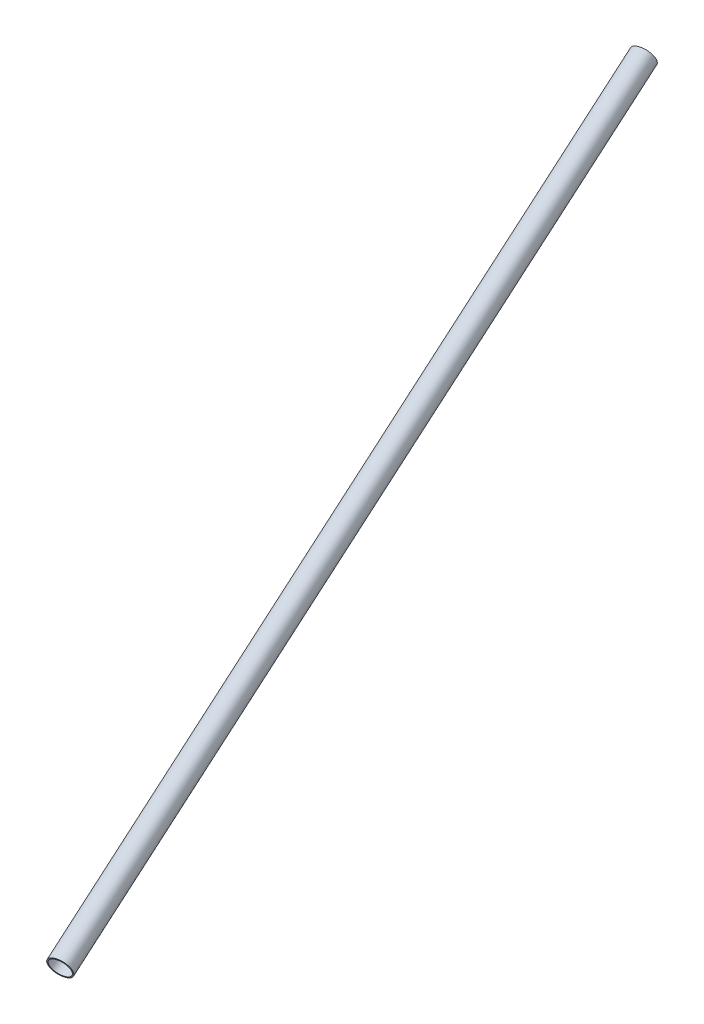
ISO-10303-21;
HEADER;
FILE_DESCRIPTION(('STEP AP214'),'2;1');
FILE_NAME('part.step','',(''),(''),'','','');
FILE_SCHEMA(('AUTOMOTIVE_DESIGN { 1 0 10303 214 1 1 1 1 }'));
ENDSEC;
DATA;
#1=APPLICATION_CONTEXT('core data for automotive mechanical design processes');
#2=APPLICATION_PROTOCOL_DEFINITION('international standard','automotive_design',2000,#1);
#3=PRODUCT_CONTEXT('',#1,'mechanical');
#4=PRODUCT('Part','Part','',(#3));
#5=PRODUCT_RELATED_PRODUCT_CATEGORY('part','',(#4));
#6=PRODUCT_DEFINITION_FORMATION('','',#4);
#7=PRODUCT_DEFINITION_CONTEXT('part definition',#1,'design');
#8=PRODUCT_DEFINITION('design','',#6,#7);
#9=PRODUCT_DEFINITION_SHAPE('','',#8);
#10=(LENGTH_UNIT() NAMED_UNIT(*) SI_UNIT(.MILLI.,.METRE.));
#11=(NAMED_UNIT(*) PLANE_ANGLE_UNIT() SI_UNIT($,.RADIAN.));
#12=(NAMED_UNIT(*) SI_UNIT($,.STERADIAN.) SOLID_ANGLE_UNIT());
#13=UNCERTAINTY_MEASURE_WITH_UNIT(LENGTH_MEASURE(1.E-05),#10,'distance_accuracy_value','');
#14=(GEOMETRIC_REPRESENTATION_CONTEXT(3) GLOBAL_UNCERTAINTY_ASSIGNED_CONTEXT((#13)) GLOBAL_UNIT_ASSIGNED_CONTEXT((#10,
#11,#12)) REPRESENTATION_CONTEXT('',''));
#15=CARTESIAN_POINT('',(0.,0.,0.));
#16=DIRECTION('',(0.,0.,1.));
#17=DIRECTION('',(1.,0.,0.));
#18=AXIS2_PLACEMENT_3D('',#15,#16,#17);
#19=CARTESIAN_POINT('',(-325.,320.,-1580.));
#20=DIRECTION('',(0.208710809439999,-0.381642622975999,0.900438063583998));
#21=DIRECTION('',(0.,-0.920714591276893,-0.390236647958419));
#22=AXIS2_PLACEMENT_3D('',#19,#20,#21);
#23=CYLINDRICAL_SURFACE('',#22,9.79999999999998);
#24=CARTESIAN_POINT('',(-325.,320.,-1580.));
#25=DIRECTION('',(-0.208710809439999,0.381642622975999,-0.900438063583998));
#26=DIRECTION('',(0.626062072534467,-0.655192350751652,-0.422811145608027));
#27=AXIS2_PLACEMENT_3D('',#24,#25,#26);
#28=CIRCLE('',#27,9.79999999999998);
#29=CARTESIAN_POINT('',(-318.864591689162,313.579114962633,-1584.14354922696));
#30=VERTEX_POINT('',#29);
#31=EDGE_CURVE('E46',#30,#30,#28,.T.);
#32=ORIENTED_EDGE('',*,*,#31,.T.);
#33=EDGE_LOOP('',(#32));
#34=FACE_BOUND('',#33,.T.);
#35=CARTESIAN_POINT('',(-150.,-4.44089209850063E-13,-825.));
#36=DIRECTION('',(-0.208710809439999,0.381642622975999,-0.900438063583998));
#37=DIRECTION('',(0.626062072534467,-0.655192350751652,-0.422811145608027));
#38=AXIS2_PLACEMENT_3D('',#35,#36,#37);
#39=CIRCLE('',#38,9.79999999999998);
#40=CARTESIAN_POINT('',(-143.864591689163,-6.42088503736662,-829.143549226959));
#41=VERTEX_POINT('',#40);
#42=EDGE_CURVE('E52',#41,#41,#39,.T.);
#43=ORIENTED_EDGE('',*,*,#42,.F.);
#44=EDGE_LOOP('',(#43));
#45=FACE_BOUND('',#44,.T.);
#46=ADVANCED_FACE('F39',(#34,#45),#23,.F.);
#47=CARTESIAN_POINT('',(-325.,320.,-1580.));
#48=DIRECTION('',(0.208710809439999,-0.381642622975999,0.900438063583998));
#49=DIRECTION('',(0.,-0.920714591276893,-0.390236647958419));
#50=AXIS2_PLACEMENT_3D('',#47,#48,#49);
#51=CYLINDRICAL_SURFACE('',#50,11.);
#52=CARTESIAN_POINT('',(-325.,320.,-1580.));
#53=DIRECTION('',(-0.208710809439999,0.381642622975999,-0.900438063583998));
#54=DIRECTION('',(0.626062072534467,-0.655192350751652,-0.422811145608027));
#55=AXIS2_PLACEMENT_3D('',#52,#53,#54);
#56=CIRCLE('',#55,11.);
#57=CARTESIAN_POINT('',(-318.113317202121,312.792884141731,-1584.65092260169));
#58=VERTEX_POINT('',#57);
#59=EDGE_CURVE('E10',#58,#58,#56,.T.);
#60=ORIENTED_EDGE('',*,*,#59,.F.);
#61=EDGE_LOOP('',(#60));
#62=FACE_BOUND('',#61,.T.);
#63=CARTESIAN_POINT('',(-150.,-4.44089209850063E-13,-825.));
#64=DIRECTION('',(-0.208710809439999,0.381642622975999,-0.900438063583998));
#65=DIRECTION('',(0.626062072534467,-0.655192350751652,-0.422811145608027));
#66=AXIS2_PLACEMENT_3D('',#63,#64,#65);
#67=CIRCLE('',#66,11.);
#68=CARTESIAN_POINT('',(-143.113317202121,-7.20711585826862,-829.650922601688));
#69=VERTEX_POINT('',#68);
#70=EDGE_CURVE('E42',#69,#69,#67,.T.);
#71=ORIENTED_EDGE('',*,*,#70,.T.);
#72=EDGE_LOOP('',(#71));
#73=FACE_BOUND('',#72,.T.);
#74=ADVANCED_FACE('F59',(#62,#73),#51,.T.);
#75=CARTESIAN_POINT('',(-325.,320.,-1580.));
#76=DIRECTION('',(-0.208710809439999,0.381642622975999,-0.900438063583998));
#77=DIRECTION('',(0.626062072534467,-0.655192350751652,-0.422811145608027));
#78=AXIS2_PLACEMENT_3D('',#75,#76,#77);
#79=PLANE('',#78);
#80=ORIENTED_EDGE('',*,*,#31,.F.);
#81=EDGE_LOOP('',(#80));
#82=FACE_BOUND('',#81,.T.);
#83=ORIENTED_EDGE('',*,*,#59,.T.);
#84=EDGE_LOOP('',(#83));
#85=FACE_BOUND('',#84,.T.);
#86=ADVANCED_FACE('F63',(#82,#85),#79,.T.);
#87=CARTESIAN_POINT('',(-150.,-4.44089209850063E-13,-825.));
#88=DIRECTION('',(-0.208710809439999,0.381642622975999,-0.900438063583998));
#89=DIRECTION('',(0.626062072534467,-0.655192350751652,-0.422811145608027));
#90=AXIS2_PLACEMENT_3D('',#87,#88,#89);
#91=PLANE('',#90);
#92=ORIENTED_EDGE('',*,*,#42,.T.);
#93=EDGE_LOOP('',(#92));
#94=FACE_BOUND('',#93,.T.);
#95=ORIENTED_EDGE('',*,*,#70,.F.);
#96=EDGE_LOOP('',(#95));
#97=FACE_BOUND('',#96,.T.);
#98=ADVANCED_FACE('F61',(#94,#97),#91,.F.);
#99=CLOSED_SHELL('',(#46,#74,#86,#98));
#100=MANIFOLD_SOLID_BREP('B2',#99);
#101=ADVANCED_BREP_SHAPE_REPRESENTATION('',(#18,#100),#14);
#102=SHAPE_DEFINITION_REPRESENTATION(#9,#101);
ENDSEC;
END-ISO-10303-21;
